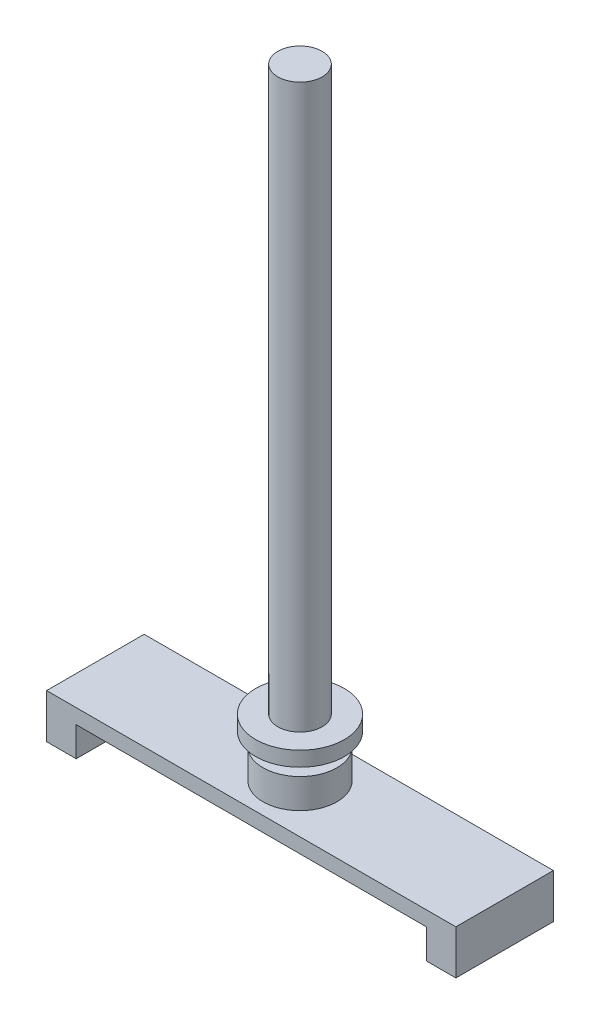
ISO-10303-21;
HEADER;
FILE_DESCRIPTION(('STEP AP214'),'2;1');
FILE_NAME('part.step','',(''),(''),'','','');
FILE_SCHEMA(('AUTOMOTIVE_DESIGN { 1 0 10303 214 1 1 1 1 }'));
ENDSEC;
DATA;
#1=APPLICATION_CONTEXT('core data for automotive mechanical design processes');
#2=APPLICATION_PROTOCOL_DEFINITION('international standard','automotive_design',2000,#1);
#3=PRODUCT_CONTEXT('',#1,'mechanical');
#4=PRODUCT('Part','Part','',(#3));
#5=PRODUCT_RELATED_PRODUCT_CATEGORY('part','',(#4));
#6=PRODUCT_DEFINITION_FORMATION('','',#4);
#7=PRODUCT_DEFINITION_CONTEXT('part definition',#1,'design');
#8=PRODUCT_DEFINITION('design','',#6,#7);
#9=PRODUCT_DEFINITION_SHAPE('','',#8);
#10=(LENGTH_UNIT() NAMED_UNIT(*) SI_UNIT(.MILLI.,.METRE.));
#11=(NAMED_UNIT(*) PLANE_ANGLE_UNIT() SI_UNIT($,.RADIAN.));
#12=(NAMED_UNIT(*) SI_UNIT($,.STERADIAN.) SOLID_ANGLE_UNIT());
#13=UNCERTAINTY_MEASURE_WITH_UNIT(LENGTH_MEASURE(1.E-05),#10,'distance_accuracy_value','');
#14=(GEOMETRIC_REPRESENTATION_CONTEXT(3) GLOBAL_UNCERTAINTY_ASSIGNED_CONTEXT((#13)) GLOBAL_UNIT_ASSIGNED_CONTEXT((#10,
#11,#12)) REPRESENTATION_CONTEXT('',''));
#15=CARTESIAN_POINT('',(0.,0.,0.));
#16=DIRECTION('',(0.,0.,1.));
#17=DIRECTION('',(1.,0.,0.));
#18=AXIS2_PLACEMENT_3D('',#15,#16,#17);
#19=CARTESIAN_POINT('',(0.,420.,0.));
#20=DIRECTION('',(0.,-1.,0.));
#21=DIRECTION('',(1.,0.,0.));
#22=AXIS2_PLACEMENT_3D('',#19,#20,#21);
#23=CYLINDRICAL_SURFACE('',#22,15.);
#24=CARTESIAN_POINT('',(0.,20.,0.));
#25=DIRECTION('',(0.,1.,0.));
#26=DIRECTION('',(-1.,0.,0.));
#27=AXIS2_PLACEMENT_3D('',#24,#25,#26);
#28=CIRCLE('',#27,15.);
#29=CARTESIAN_POINT('',(-15.,20.,0.));
#30=VERTEX_POINT('',#29);
#31=EDGE_CURVE('E42',#30,#30,#28,.T.);
#32=ORIENTED_EDGE('',*,*,#31,.T.);
#33=EDGE_LOOP('',(#32));
#34=FACE_BOUND('',#33,.T.);
#35=CARTESIAN_POINT('',(0.,29.,0.));
#36=DIRECTION('',(0.,1.,0.));
#37=DIRECTION('',(-1.,0.,0.));
#38=AXIS2_PLACEMENT_3D('',#35,#36,#37);
#39=CIRCLE('',#38,15.);
#40=CARTESIAN_POINT('',(-15.,29.,0.));
#41=VERTEX_POINT('',#40);
#42=EDGE_CURVE('E11',#41,#41,#39,.T.);
#43=ORIENTED_EDGE('',*,*,#42,.F.);
#44=EDGE_LOOP('',(#43));
#45=FACE_BOUND('',#44,.T.);
#46=ADVANCED_FACE('F33',(#34,#45),#23,.T.);
#47=CARTESIAN_POINT('',(-138.5,-29.9999999999999,-33.));
#48=DIRECTION('',(0.,-1.,0.));
#49=DIRECTION('',(1.,0.,0.));
#50=AXIS2_PLACEMENT_3D('',#47,#48,#49);
#51=PLANE('',#50);
#52=DIRECTION('',(0.,0.,1.));
#53=VECTOR('',#52,1.);
#54=CARTESIAN_POINT('',(-123.5,-30.,31.5));
#55=LINE('',#54,#53);
#56=CARTESIAN_POINT('',(-123.5,-30.,-31.5));
#57=VERTEX_POINT('',#56);
#58=CARTESIAN_POINT('',(-123.5,-29.9999999999999,31.5));
#59=VERTEX_POINT('',#58);
#60=EDGE_CURVE('E49',#57,#59,#55,.T.);
#61=ORIENTED_EDGE('',*,*,#60,.F.);
#62=DIRECTION('',(1.,0.,0.));
#63=VECTOR('',#62,1.);
#64=CARTESIAN_POINT('',(-133.5,-30.,-31.5));
#65=LINE('',#64,#63);
#66=CARTESIAN_POINT('',(-133.5,-30.,-31.5));
#67=VERTEX_POINT('',#66);
#68=EDGE_CURVE('E167',#67,#57,#65,.T.);
#69=ORIENTED_EDGE('',*,*,#68,.F.);
#70=DIRECTION('',(0.,0.,-1.));
#71=VECTOR('',#70,1.);
#72=CARTESIAN_POINT('',(-133.5,-30.,31.5));
#73=LINE('',#72,#71);
#74=CARTESIAN_POINT('',(-133.5,-30.,31.5));
#75=VERTEX_POINT('',#74);
#76=EDGE_CURVE('E170',#75,#67,#73,.T.);
#77=ORIENTED_EDGE('',*,*,#76,.F.);
#78=DIRECTION('',(-1.,0.,0.));
#79=VECTOR('',#78,1.);
#80=CARTESIAN_POINT('',(-133.5,-30.,31.5));
#81=LINE('',#80,#79);
#82=EDGE_CURVE('E179',#59,#75,#81,.T.);
#83=ORIENTED_EDGE('',*,*,#82,.F.);
#84=EDGE_LOOP('',(#61,#69,#77,#83));
#85=FACE_BOUND('',#84,.T.);
#86=DIRECTION('',(0.,0.,1.));
#87=VECTOR('',#86,1.);
#88=CARTESIAN_POINT('',(-118.5,-29.9999999999999,-33.));
#89=LINE('',#88,#87);
#90=CARTESIAN_POINT('',(-118.5,-29.9999999999999,-33.));
#91=VERTEX_POINT('',#90);
#92=CARTESIAN_POINT('',(-118.5,-29.9999999999999,33.));
#93=VERTEX_POINT('',#92);
#94=EDGE_CURVE('E267',#91,#93,#89,.T.);
#95=ORIENTED_EDGE('',*,*,#94,.T.);
#96=DIRECTION('',(1.,0.,0.));
#97=VECTOR('',#96,1.);
#98=CARTESIAN_POINT('',(-138.5,-29.9999999999999,33.));
#99=LINE('',#98,#97);
#100=CARTESIAN_POINT('',(-138.5,-29.9999999999999,33.));
#101=VERTEX_POINT('',#100);
#102=EDGE_CURVE('E186',#101,#93,#99,.T.);
#103=ORIENTED_EDGE('',*,*,#102,.F.);
#104=DIRECTION('',(0.,0.,1.));
#105=VECTOR('',#104,1.);
#106=CARTESIAN_POINT('',(-138.5,-29.9999999999999,-33.));
#107=LINE('',#106,#105);
#108=CARTESIAN_POINT('',(-138.5,-29.9999999999999,-33.));
#109=VERTEX_POINT('',#108);
#110=EDGE_CURVE('E268',#109,#101,#107,.T.);
#111=ORIENTED_EDGE('',*,*,#110,.F.);
#112=DIRECTION('',(1.,0.,0.));
#113=VECTOR('',#112,1.);
#114=CARTESIAN_POINT('',(-138.5,-29.9999999999999,-33.));
#115=LINE('',#114,#113);
#116=EDGE_CURVE('E243',#109,#91,#115,.T.);
#117=ORIENTED_EDGE('',*,*,#116,.T.);
#118=EDGE_LOOP('',(#95,#103,#111,#117));
#119=FACE_BOUND('',#118,.T.);
#120=ADVANCED_FACE('F35',(#85,#119),#51,.T.);
#121=CARTESIAN_POINT('',(-138.5,0.,-33.));
#122=DIRECTION('',(-1.,0.,0.));
#123=DIRECTION('',(0.,-1.,0.));
#124=AXIS2_PLACEMENT_3D('',#121,#122,#123);
#125=PLANE('',#124);
#126=ORIENTED_EDGE('',*,*,#110,.T.);
#127=DIRECTION('',(0.,-1.,0.));
#128=VECTOR('',#127,1.);
#129=CARTESIAN_POINT('',(-138.5,0.,33.));
#130=LINE('',#129,#128);
#131=CARTESIAN_POINT('',(-138.5,0.,33.));
#132=VERTEX_POINT('',#131);
#133=EDGE_CURVE('E240',#132,#101,#130,.T.);
#134=ORIENTED_EDGE('',*,*,#133,.F.);
#135=DIRECTION('',(0.,0.,1.));
#136=VECTOR('',#135,1.);
#137=CARTESIAN_POINT('',(-138.5,0.,-33.));
#138=LINE('',#137,#136);
#139=CARTESIAN_POINT('',(-138.5,0.,-33.));
#140=VERTEX_POINT('',#139);
#141=EDGE_CURVE('E270',#140,#132,#138,.T.);
#142=ORIENTED_EDGE('',*,*,#141,.F.);
#143=DIRECTION('',(0.,-1.,0.));
#144=VECTOR('',#143,1.);
#145=CARTESIAN_POINT('',(-138.5,0.,-33.));
#146=LINE('',#145,#144);
#147=EDGE_CURVE('E264',#140,#109,#146,.T.);
#148=ORIENTED_EDGE('',*,*,#147,.T.);
#149=EDGE_LOOP('',(#126,#134,#142,#148));
#150=FACE_BOUND('',#149,.T.);
#151=ADVANCED_FACE('F295',(#150),#125,.T.);
#152=CARTESIAN_POINT('',(-138.5,0.,-33.));
#153=DIRECTION('',(0.,1.,0.));
#154=DIRECTION('',(0.,0.,1.));
#155=AXIS2_PLACEMENT_3D('',#152,#153,#154);
#156=PLANE('',#155);
#157=CARTESIAN_POINT('',(0.,0.,0.));
#158=DIRECTION('',(0.,1.,0.));
#159=DIRECTION('',(-1.,0.,0.));
#160=AXIS2_PLACEMENT_3D('',#157,#158,#159);
#161=CIRCLE('',#160,25.);
#162=CARTESIAN_POINT('',(-25.,0.,0.));
#163=VERTEX_POINT('',#162);
#164=EDGE_CURVE('E173',#163,#163,#161,.T.);
#165=ORIENTED_EDGE('',*,*,#164,.F.);
#166=EDGE_LOOP('',(#165));
#167=FACE_BOUND('',#166,.T.);
#168=ORIENTED_EDGE('',*,*,#141,.T.);
#169=DIRECTION('',(-1.,0.,0.));
#170=VECTOR('',#169,1.);
#171=CARTESIAN_POINT('',(-138.5,0.,33.));
#172=LINE('',#171,#170);
#173=CARTESIAN_POINT('',(138.5,0.,33.));
#174=VERTEX_POINT('',#173);
#175=EDGE_CURVE('E237',#174,#132,#172,.T.);
#176=ORIENTED_EDGE('',*,*,#175,.F.);
#177=DIRECTION('',(0.,0.,1.));
#178=VECTOR('',#177,1.);
#179=CARTESIAN_POINT('',(138.5,0.,-33.));
#180=LINE('',#179,#178);
#181=CARTESIAN_POINT('',(138.5,0.,-33.));
#182=VERTEX_POINT('',#181);
#183=EDGE_CURVE('E272',#182,#174,#180,.T.);
#184=ORIENTED_EDGE('',*,*,#183,.F.);
#185=DIRECTION('',(-1.,0.,0.));
#186=VECTOR('',#185,1.);
#187=CARTESIAN_POINT('',(-138.5,0.,-33.));
#188=LINE('',#187,#186);
#189=EDGE_CURVE('E261',#182,#140,#188,.T.);
#190=ORIENTED_EDGE('',*,*,#189,.T.);
#191=EDGE_LOOP('',(#168,#176,#184,#190));
#192=FACE_BOUND('',#191,.T.);
#193=ADVANCED_FACE('F316',(#167,#192),#156,.T.);
#194=CARTESIAN_POINT('',(138.5,0.,-33.));
#195=DIRECTION('',(1.,0.,0.));
#196=DIRECTION('',(0.,1.,0.));
#197=AXIS2_PLACEMENT_3D('',#194,#195,#196);
#198=PLANE('',#197);
#199=ORIENTED_EDGE('',*,*,#183,.T.);
#200=DIRECTION('',(0.,1.,0.));
#201=VECTOR('',#200,1.);
#202=CARTESIAN_POINT('',(138.5,0.,33.));
#203=LINE('',#202,#201);
#204=CARTESIAN_POINT('',(138.5,-29.9999999999999,33.));
#205=VERTEX_POINT('',#204);
#206=EDGE_CURVE('E234',#205,#174,#203,.T.);
#207=ORIENTED_EDGE('',*,*,#206,.F.);
#208=DIRECTION('',(0.,0.,1.));
#209=VECTOR('',#208,1.);
#210=CARTESIAN_POINT('',(138.5,-29.9999999999999,-33.));
#211=LINE('',#210,#209);
#212=CARTESIAN_POINT('',(138.5,-29.9999999999999,-33.));
#213=VERTEX_POINT('',#212);
#214=EDGE_CURVE('E274',#213,#205,#211,.T.);
#215=ORIENTED_EDGE('',*,*,#214,.F.);
#216=DIRECTION('',(0.,1.,0.));
#217=VECTOR('',#216,1.);
#218=CARTESIAN_POINT('',(138.5,0.,-33.));
#219=LINE('',#218,#217);
#220=EDGE_CURVE('E258',#213,#182,#219,.T.);
#221=ORIENTED_EDGE('',*,*,#220,.T.);
#222=EDGE_LOOP('',(#199,#207,#215,#221));
#223=FACE_BOUND('',#222,.T.);
#224=ADVANCED_FACE('F313',(#223),#198,.T.);
#225=CARTESIAN_POINT('',(138.5,-29.9999999999999,-33.));
#226=DIRECTION('',(0.,-1.,0.));
#227=DIRECTION('',(1.,0.,0.));
#228=AXIS2_PLACEMENT_3D('',#225,#226,#227);
#229=PLANE('',#228);
#230=DIRECTION('',(0.,0.,1.));
#231=VECTOR('',#230,1.);
#232=CARTESIAN_POINT('',(133.5,-30.,31.5));
#233=LINE('',#232,#231);
#234=CARTESIAN_POINT('',(133.5,-30.,-31.5));
#235=VERTEX_POINT('',#234);
#236=CARTESIAN_POINT('',(133.5,-29.9999999999999,31.5));
#237=VERTEX_POINT('',#236);
#238=EDGE_CURVE('E57',#235,#237,#233,.T.);
#239=ORIENTED_EDGE('',*,*,#238,.F.);
#240=DIRECTION('',(1.,0.,0.));
#241=VECTOR('',#240,1.);
#242=CARTESIAN_POINT('',(133.5,-30.,-31.5));
#243=LINE('',#242,#241);
#244=CARTESIAN_POINT('',(123.5,-30.,-31.5));
#245=VERTEX_POINT('',#244);
#246=EDGE_CURVE('E194',#245,#235,#243,.T.);
#247=ORIENTED_EDGE('',*,*,#246,.F.);
#248=DIRECTION('',(0.,0.,-1.));
#249=VECTOR('',#248,1.);
#250=CARTESIAN_POINT('',(123.5,-30.,31.5));
#251=LINE('',#250,#249);
#252=CARTESIAN_POINT('',(123.5,-30.,31.5));
#253=VERTEX_POINT('',#252);
#254=EDGE_CURVE('E209',#253,#245,#251,.T.);
#255=ORIENTED_EDGE('',*,*,#254,.F.);
#256=DIRECTION('',(-1.,0.,0.));
#257=VECTOR('',#256,1.);
#258=CARTESIAN_POINT('',(133.5,-30.,31.5));
#259=LINE('',#258,#257);
#260=EDGE_CURVE('E205',#237,#253,#259,.T.);
#261=ORIENTED_EDGE('',*,*,#260,.F.);
#262=EDGE_LOOP('',(#239,#247,#255,#261));
#263=FACE_BOUND('',#262,.T.);
#264=ORIENTED_EDGE('',*,*,#214,.T.);
#265=DIRECTION('',(1.,0.,0.));
#266=VECTOR('',#265,1.);
#267=CARTESIAN_POINT('',(138.5,-29.9999999999999,33.));
#268=LINE('',#267,#266);
#269=CARTESIAN_POINT('',(118.5,-29.9999999999999,33.));
#270=VERTEX_POINT('',#269);
#271=EDGE_CURVE('E231',#270,#205,#268,.T.);
#272=ORIENTED_EDGE('',*,*,#271,.F.);
#273=DIRECTION('',(0.,0.,1.));
#274=VECTOR('',#273,1.);
#275=CARTESIAN_POINT('',(118.5,-29.9999999999999,-33.));
#276=LINE('',#275,#274);
#277=CARTESIAN_POINT('',(118.5,-29.9999999999999,-33.));
#278=VERTEX_POINT('',#277);
#279=EDGE_CURVE('E276',#278,#270,#276,.T.);
#280=ORIENTED_EDGE('',*,*,#279,.F.);
#281=DIRECTION('',(1.,0.,0.));
#282=VECTOR('',#281,1.);
#283=CARTESIAN_POINT('',(138.5,-29.9999999999999,-33.));
#284=LINE('',#283,#282);
#285=EDGE_CURVE('E255',#278,#213,#284,.T.);
#286=ORIENTED_EDGE('',*,*,#285,.T.);
#287=EDGE_LOOP('',(#264,#272,#280,#286));
#288=FACE_BOUND('',#287,.T.);
#289=ADVANCED_FACE('F310',(#263,#288),#229,.T.);
#290=CARTESIAN_POINT('',(118.5,-29.9999999999999,-33.));
#291=DIRECTION('',(-1.,0.,0.));
#292=DIRECTION('',(0.,0.,1.));
#293=AXIS2_PLACEMENT_3D('',#290,#291,#292);
#294=PLANE('',#293);
#295=ORIENTED_EDGE('',*,*,#279,.T.);
#296=DIRECTION('',(0.,-1.,0.));
#297=VECTOR('',#296,1.);
#298=CARTESIAN_POINT('',(118.5,-29.9999999999999,33.));
#299=LINE('',#298,#297);
#300=CARTESIAN_POINT('',(118.5,-9.99999999999993,33.));
#301=VERTEX_POINT('',#300);
#302=EDGE_CURVE('E228',#301,#270,#299,.T.);
#303=ORIENTED_EDGE('',*,*,#302,.F.);
#304=DIRECTION('',(0.,0.,1.));
#305=VECTOR('',#304,1.);
#306=CARTESIAN_POINT('',(118.5,-9.99999999999993,-33.));
#307=LINE('',#306,#305);
#308=CARTESIAN_POINT('',(118.5,-9.99999999999993,-33.));
#309=VERTEX_POINT('',#308);
#310=EDGE_CURVE('E278',#309,#301,#307,.T.);
#311=ORIENTED_EDGE('',*,*,#310,.F.);
#312=DIRECTION('',(0.,-1.,0.));
#313=VECTOR('',#312,1.);
#314=CARTESIAN_POINT('',(118.5,-29.9999999999999,-33.));
#315=LINE('',#314,#313);
#316=EDGE_CURVE('E252',#309,#278,#315,.T.);
#317=ORIENTED_EDGE('',*,*,#316,.T.);
#318=EDGE_LOOP('',(#295,#303,#311,#317));
#319=FACE_BOUND('',#318,.T.);
#320=ADVANCED_FACE('F308',(#319),#294,.T.);
#321=CARTESIAN_POINT('',(118.5,-9.99999999999993,-33.));
#322=DIRECTION('',(0.,-1.,0.));
#323=DIRECTION('',(0.,0.,-1.));
#324=AXIS2_PLACEMENT_3D('',#321,#322,#323);
#325=PLANE('',#324);
#326=ORIENTED_EDGE('',*,*,#310,.T.);
#327=DIRECTION('',(1.,0.,0.));
#328=VECTOR('',#327,1.);
#329=CARTESIAN_POINT('',(118.5,-9.99999999999993,33.));
#330=LINE('',#329,#328);
#331=CARTESIAN_POINT('',(-118.5,-9.99999999999993,33.));
#332=VERTEX_POINT('',#331);
#333=EDGE_CURVE('E225',#332,#301,#330,.T.);
#334=ORIENTED_EDGE('',*,*,#333,.F.);
#335=DIRECTION('',(0.,0.,1.));
#336=VECTOR('',#335,1.);
#337=CARTESIAN_POINT('',(-118.5,-9.99999999999993,-33.));
#338=LINE('',#337,#336);
#339=CARTESIAN_POINT('',(-118.5,-9.99999999999993,-33.));
#340=VERTEX_POINT('',#339);
#341=EDGE_CURVE('E280',#340,#332,#338,.T.);
#342=ORIENTED_EDGE('',*,*,#341,.F.);
#343=DIRECTION('',(1.,0.,0.));
#344=VECTOR('',#343,1.);
#345=CARTESIAN_POINT('',(118.5,-9.99999999999993,-33.));
#346=LINE('',#345,#344);
#347=EDGE_CURVE('E249',#340,#309,#346,.T.);
#348=ORIENTED_EDGE('',*,*,#347,.T.);
#349=EDGE_LOOP('',(#326,#334,#342,#348));
#350=FACE_BOUND('',#349,.T.);
#351=ADVANCED_FACE('F304',(#350),#325,.T.);
#352=CARTESIAN_POINT('',(-118.5,-29.9999999999999,-33.));
#353=DIRECTION('',(1.,0.,0.));
#354=DIRECTION('',(0.,0.,-1.));
#355=AXIS2_PLACEMENT_3D('',#352,#353,#354);
#356=PLANE('',#355);
#357=ORIENTED_EDGE('',*,*,#341,.T.);
#358=DIRECTION('',(0.,1.,0.));
#359=VECTOR('',#358,1.);
#360=CARTESIAN_POINT('',(-118.5,-29.9999999999999,33.));
#361=LINE('',#360,#359);
#362=EDGE_CURVE('E222',#93,#332,#361,.T.);
#363=ORIENTED_EDGE('',*,*,#362,.F.);
#364=ORIENTED_EDGE('',*,*,#94,.F.);
#365=DIRECTION('',(0.,1.,0.));
#366=VECTOR('',#365,1.);
#367=CARTESIAN_POINT('',(-118.5,-29.9999999999999,-33.));
#368=LINE('',#367,#366);
#369=EDGE_CURVE('E246',#91,#340,#368,.T.);
#370=ORIENTED_EDGE('',*,*,#369,.T.);
#371=EDGE_LOOP('',(#357,#363,#364,#370));
#372=FACE_BOUND('',#371,.T.);
#373=ADVANCED_FACE('F288',(#372),#356,.T.);
#374=CARTESIAN_POINT('',(0.,0.,-33.));
#375=DIRECTION('',(0.,0.,1.));
#376=DIRECTION('',(1.,0.,0.));
#377=AXIS2_PLACEMENT_3D('',#374,#375,#376);
#378=PLANE('',#377);
#379=ORIENTED_EDGE('',*,*,#116,.F.);
#380=ORIENTED_EDGE('',*,*,#147,.F.);
#381=ORIENTED_EDGE('',*,*,#189,.F.);
#382=ORIENTED_EDGE('',*,*,#220,.F.);
#383=ORIENTED_EDGE('',*,*,#285,.F.);
#384=ORIENTED_EDGE('',*,*,#316,.F.);
#385=ORIENTED_EDGE('',*,*,#347,.F.);
#386=ORIENTED_EDGE('',*,*,#369,.F.);
#387=EDGE_LOOP('',(#379,#380,#381,#382,#383,#384,#385,#386));
#388=FACE_BOUND('',#387,.T.);
#389=ADVANCED_FACE('F298',(#388),#378,.F.);
#390=CARTESIAN_POINT('',(0.,0.,33.));
#391=DIRECTION('',(0.,0.,1.));
#392=DIRECTION('',(1.,0.,0.));
#393=AXIS2_PLACEMENT_3D('',#390,#391,#392);
#394=PLANE('',#393);
#395=ORIENTED_EDGE('',*,*,#102,.T.);
#396=ORIENTED_EDGE('',*,*,#362,.T.);
#397=ORIENTED_EDGE('',*,*,#333,.T.);
#398=ORIENTED_EDGE('',*,*,#302,.T.);
#399=ORIENTED_EDGE('',*,*,#271,.T.);
#400=ORIENTED_EDGE('',*,*,#206,.T.);
#401=ORIENTED_EDGE('',*,*,#175,.T.);
#402=ORIENTED_EDGE('',*,*,#133,.T.);
#403=EDGE_LOOP('',(#395,#396,#397,#398,#399,#400,#401,#402));
#404=FACE_BOUND('',#403,.T.);
#405=ADVANCED_FACE('F291',(#404),#394,.T.);
#406=CARTESIAN_POINT('',(133.5,-9.99999999999997,31.5));
#407=DIRECTION('',(1.,0.,0.));
#408=DIRECTION('',(0.,0.,-1.));
#409=AXIS2_PLACEMENT_3D('',#406,#407,#408);
#410=PLANE('',#409);
#411=ORIENTED_EDGE('',*,*,#238,.T.);
#412=DIRECTION('',(0.,-1.,0.));
#413=VECTOR('',#412,1.);
#414=CARTESIAN_POINT('',(133.5,-9.99999999999997,31.5));
#415=LINE('',#414,#413);
#416=CARTESIAN_POINT('',(133.5,-9.99999999999997,31.5));
#417=VERTEX_POINT('',#416);
#418=EDGE_CURVE('E203',#417,#237,#415,.T.);
#419=ORIENTED_EDGE('',*,*,#418,.F.);
#420=DIRECTION('',(0.,0.,1.));
#421=VECTOR('',#420,1.);
#422=CARTESIAN_POINT('',(133.5,-9.99999999999997,31.5));
#423=LINE('',#422,#421);
#424=CARTESIAN_POINT('',(133.5,-9.99999999999997,-31.5));
#425=VERTEX_POINT('',#424);
#426=EDGE_CURVE('E190',#425,#417,#423,.T.);
#427=ORIENTED_EDGE('',*,*,#426,.F.);
#428=DIRECTION('',(0.,-1.,0.));
#429=VECTOR('',#428,1.);
#430=CARTESIAN_POINT('',(133.5,-9.99999999999997,-31.5));
#431=LINE('',#430,#429);
#432=EDGE_CURVE('E180',#425,#235,#431,.T.);
#433=ORIENTED_EDGE('',*,*,#432,.T.);
#434=EDGE_LOOP('',(#411,#419,#427,#433));
#435=FACE_BOUND('',#434,.T.);
#436=ADVANCED_FACE('F398',(#435),#410,.F.);
#437=CARTESIAN_POINT('',(133.5,-9.99999999999997,-31.5));
#438=DIRECTION('',(0.,0.,-1.));
#439=DIRECTION('',(-1.,0.,0.));
#440=AXIS2_PLACEMENT_3D('',#437,#438,#439);
#441=PLANE('',#440);
#442=ORIENTED_EDGE('',*,*,#246,.T.);
#443=ORIENTED_EDGE('',*,*,#432,.F.);
#444=DIRECTION('',(1.,0.,0.));
#445=VECTOR('',#444,1.);
#446=CARTESIAN_POINT('',(133.5,-9.99999999999997,-31.5));
#447=LINE('',#446,#445);
#448=CARTESIAN_POINT('',(123.5,-9.99999999999997,-31.5));
#449=VERTEX_POINT('',#448);
#450=EDGE_CURVE('E200',#449,#425,#447,.T.);
#451=ORIENTED_EDGE('',*,*,#450,.F.);
#452=DIRECTION('',(0.,-1.,0.));
#453=VECTOR('',#452,1.);
#454=CARTESIAN_POINT('',(123.5,-9.99999999999997,-31.5));
#455=LINE('',#454,#453);
#456=EDGE_CURVE('E215',#449,#245,#455,.T.);
#457=ORIENTED_EDGE('',*,*,#456,.T.);
#458=EDGE_LOOP('',(#442,#443,#451,#457));
#459=FACE_BOUND('',#458,.T.);
#460=ADVANCED_FACE('F394',(#459),#441,.F.);
#461=CARTESIAN_POINT('',(123.5,-9.99999999999997,31.5));
#462=DIRECTION('',(-1.,0.,0.));
#463=DIRECTION('',(0.,0.,1.));
#464=AXIS2_PLACEMENT_3D('',#461,#462,#463);
#465=PLANE('',#464);
#466=ORIENTED_EDGE('',*,*,#254,.T.);
#467=ORIENTED_EDGE('',*,*,#456,.F.);
#468=DIRECTION('',(0.,0.,-1.));
#469=VECTOR('',#468,1.);
#470=CARTESIAN_POINT('',(123.5,-9.99999999999997,31.5));
#471=LINE('',#470,#469);
#472=CARTESIAN_POINT('',(123.5,-9.99999999999997,31.5));
#473=VERTEX_POINT('',#472);
#474=EDGE_CURVE('E197',#473,#449,#471,.T.);
#475=ORIENTED_EDGE('',*,*,#474,.F.);
#476=DIRECTION('',(0.,-1.,0.));
#477=VECTOR('',#476,1.);
#478=CARTESIAN_POINT('',(123.5,-9.99999999999997,31.5));
#479=LINE('',#478,#477);
#480=EDGE_CURVE('E217',#473,#253,#479,.T.);
#481=ORIENTED_EDGE('',*,*,#480,.T.);
#482=EDGE_LOOP('',(#466,#467,#475,#481));
#483=FACE_BOUND('',#482,.T.);
#484=ADVANCED_FACE('F397',(#483),#465,.F.);
#485=CARTESIAN_POINT('',(133.5,-9.99999999999997,31.5));
#486=DIRECTION('',(0.,0.,1.));
#487=DIRECTION('',(1.,0.,0.));
#488=AXIS2_PLACEMENT_3D('',#485,#486,#487);
#489=PLANE('',#488);
#490=ORIENTED_EDGE('',*,*,#260,.T.);
#491=ORIENTED_EDGE('',*,*,#480,.F.);
#492=DIRECTION('',(-1.,0.,0.));
#493=VECTOR('',#492,1.);
#494=CARTESIAN_POINT('',(133.5,-9.99999999999997,31.5));
#495=LINE('',#494,#493);
#496=EDGE_CURVE('E193',#417,#473,#495,.T.);
#497=ORIENTED_EDGE('',*,*,#496,.F.);
#498=ORIENTED_EDGE('',*,*,#418,.T.);
#499=EDGE_LOOP('',(#490,#491,#497,#498));
#500=FACE_BOUND('',#499,.T.);
#501=ADVANCED_FACE('F392',(#500),#489,.F.);
#502=CARTESIAN_POINT('',(0.,-9.99999999999997,0.));
#503=DIRECTION('',(0.,1.,0.));
#504=DIRECTION('',(0.,0.,1.));
#505=AXIS2_PLACEMENT_3D('',#502,#503,#504);
#506=PLANE('',#505);
#507=ORIENTED_EDGE('',*,*,#426,.T.);
#508=ORIENTED_EDGE('',*,*,#496,.T.);
#509=ORIENTED_EDGE('',*,*,#474,.T.);
#510=ORIENTED_EDGE('',*,*,#450,.T.);
#511=EDGE_LOOP('',(#507,#508,#509,#510));
#512=FACE_BOUND('',#511,.T.);
#513=ADVANCED_FACE('F389',(#512),#506,.F.);
#514=CARTESIAN_POINT('',(-123.5,-9.99999999999997,31.5));
#515=DIRECTION('',(1.,0.,0.));
#516=DIRECTION('',(0.,0.,-1.));
#517=AXIS2_PLACEMENT_3D('',#514,#515,#516);
#518=PLANE('',#517);
#519=ORIENTED_EDGE('',*,*,#60,.T.);
#520=DIRECTION('',(0.,-1.,0.));
#521=VECTOR('',#520,1.);
#522=CARTESIAN_POINT('',(-123.5,-9.99999999999997,31.5));
#523=LINE('',#522,#521);
#524=CARTESIAN_POINT('',(-123.5,-9.99999999999997,31.5));
#525=VERTEX_POINT('',#524);
#526=EDGE_CURVE('E145',#525,#59,#523,.T.);
#527=ORIENTED_EDGE('',*,*,#526,.F.);
#528=DIRECTION('',(0.,0.,1.));
#529=VECTOR('',#528,1.);
#530=CARTESIAN_POINT('',(-123.5,-9.99999999999997,31.5));
#531=LINE('',#530,#529);
#532=CARTESIAN_POINT('',(-123.5,-9.99999999999997,-31.5));
#533=VERTEX_POINT('',#532);
#534=EDGE_CURVE('E149',#533,#525,#531,.T.);
#535=ORIENTED_EDGE('',*,*,#534,.F.);
#536=DIRECTION('',(0.,-1.,0.));
#537=VECTOR('',#536,1.);
#538=CARTESIAN_POINT('',(-123.5,-9.99999999999997,-31.5));
#539=LINE('',#538,#537);
#540=EDGE_CURVE('E184',#533,#57,#539,.T.);
#541=ORIENTED_EDGE('',*,*,#540,.T.);
#542=EDGE_LOOP('',(#519,#527,#535,#541));
#543=FACE_BOUND('',#542,.T.);
#544=ADVANCED_FACE('F147',(#543),#518,.F.);
#545=CARTESIAN_POINT('',(-133.5,-9.99999999999997,-31.5));
#546=DIRECTION('',(0.,0.,-1.));
#547=DIRECTION('',(-1.,0.,0.));
#548=AXIS2_PLACEMENT_3D('',#545,#546,#547);
#549=PLANE('',#548);
#550=ORIENTED_EDGE('',*,*,#68,.T.);
#551=ORIENTED_EDGE('',*,*,#540,.F.);
#552=DIRECTION('',(1.,0.,0.));
#553=VECTOR('',#552,1.);
#554=CARTESIAN_POINT('',(-133.5,-9.99999999999997,-31.5));
#555=LINE('',#554,#553);
#556=CARTESIAN_POINT('',(-133.5,-9.99999999999997,-31.5));
#557=VERTEX_POINT('',#556);
#558=EDGE_CURVE('E155',#557,#533,#555,.T.);
#559=ORIENTED_EDGE('',*,*,#558,.F.);
#560=DIRECTION('',(0.,-1.,0.));
#561=VECTOR('',#560,1.);
#562=CARTESIAN_POINT('',(-133.5,-9.99999999999997,-31.5));
#563=LINE('',#562,#561);
#564=EDGE_CURVE('E187',#557,#67,#563,.T.);
#565=ORIENTED_EDGE('',*,*,#564,.T.);
#566=EDGE_LOOP('',(#550,#551,#559,#565));
#567=FACE_BOUND('',#566,.T.);
#568=ADVANCED_FACE('F377',(#567),#549,.F.);
#569=CARTESIAN_POINT('',(-133.5,-9.99999999999997,31.5));
#570=DIRECTION('',(-1.,0.,0.));
#571=DIRECTION('',(0.,0.,1.));
#572=AXIS2_PLACEMENT_3D('',#569,#570,#571);
#573=PLANE('',#572);
#574=ORIENTED_EDGE('',*,*,#76,.T.);
#575=ORIENTED_EDGE('',*,*,#564,.F.);
#576=DIRECTION('',(0.,0.,-1.));
#577=VECTOR('',#576,1.);
#578=CARTESIAN_POINT('',(-133.5,-9.99999999999997,31.5));
#579=LINE('',#578,#577);
#580=CARTESIAN_POINT('',(-133.5,-9.99999999999997,31.5));
#581=VERTEX_POINT('',#580);
#582=EDGE_CURVE('E163',#581,#557,#579,.T.);
#583=ORIENTED_EDGE('',*,*,#582,.F.);
#584=DIRECTION('',(0.,-1.,0.));
#585=VECTOR('',#584,1.);
#586=CARTESIAN_POINT('',(-133.5,-9.99999999999997,31.5));
#587=LINE('',#586,#585);
#588=EDGE_CURVE('E154',#581,#75,#587,.T.);
#589=ORIENTED_EDGE('',*,*,#588,.T.);
#590=EDGE_LOOP('',(#574,#575,#583,#589));
#591=FACE_BOUND('',#590,.T.);
#592=ADVANCED_FACE('F380',(#591),#573,.F.);
#593=CARTESIAN_POINT('',(-133.5,-9.99999999999997,31.5));
#594=DIRECTION('',(0.,0.,1.));
#595=DIRECTION('',(1.,0.,0.));
#596=AXIS2_PLACEMENT_3D('',#593,#594,#595);
#597=PLANE('',#596);
#598=ORIENTED_EDGE('',*,*,#82,.T.);
#599=ORIENTED_EDGE('',*,*,#588,.F.);
#600=DIRECTION('',(-1.,0.,0.));
#601=VECTOR('',#600,1.);
#602=CARTESIAN_POINT('',(-133.5,-9.99999999999997,31.5));
#603=LINE('',#602,#601);
#604=EDGE_CURVE('E158',#525,#581,#603,.T.);
#605=ORIENTED_EDGE('',*,*,#604,.F.);
#606=ORIENTED_EDGE('',*,*,#526,.T.);
#607=EDGE_LOOP('',(#598,#599,#605,#606));
#608=FACE_BOUND('',#607,.T.);
#609=ADVANCED_FACE('F159',(#608),#597,.F.);
#610=CARTESIAN_POINT('',(0.,-9.99999999999997,0.));
#611=DIRECTION('',(0.,-1.,0.));
#612=DIRECTION('',(0.,0.,-1.));
#613=AXIS2_PLACEMENT_3D('',#610,#611,#612);
#614=PLANE('',#613);
#615=ORIENTED_EDGE('',*,*,#534,.T.);
#616=ORIENTED_EDGE('',*,*,#604,.T.);
#617=ORIENTED_EDGE('',*,*,#582,.T.);
#618=ORIENTED_EDGE('',*,*,#558,.T.);
#619=EDGE_LOOP('',(#615,#616,#617,#618));
#620=FACE_BOUND('',#619,.T.);
#621=ADVANCED_FACE('F165',(#620),#614,.T.);
#622=CARTESIAN_POINT('',(0.,20.,0.));
#623=DIRECTION('',(0.,-1.,0.));
#624=DIRECTION('',(1.,0.,0.));
#625=AXIS2_PLACEMENT_3D('',#622,#623,#624);
#626=CYLINDRICAL_SURFACE('',#625,25.);
#627=CARTESIAN_POINT('',(0.,20.,0.));
#628=DIRECTION('',(0.,1.,0.));
#629=DIRECTION('',(-1.,0.,0.));
#630=AXIS2_PLACEMENT_3D('',#627,#628,#629);
#631=CIRCLE('',#630,25.);
#632=CARTESIAN_POINT('',(-25.,20.,0.));
#633=VERTEX_POINT('',#632);
#634=EDGE_CURVE('E206',#633,#633,#631,.T.);
#635=ORIENTED_EDGE('',*,*,#634,.F.);
#636=EDGE_LOOP('',(#635));
#637=FACE_BOUND('',#636,.T.);
#638=ORIENTED_EDGE('',*,*,#164,.T.);
#639=EDGE_LOOP('',(#638));
#640=FACE_BOUND('',#639,.T.);
#641=ADVANCED_FACE('F363',(#637,#640),#626,.T.);
#642=CARTESIAN_POINT('',(0.,20.,0.));
#643=DIRECTION('',(0.,1.,0.));
#644=DIRECTION('',(-1.,0.,0.));
#645=AXIS2_PLACEMENT_3D('',#642,#643,#644);
#646=PLANE('',#645);
#647=ORIENTED_EDGE('',*,*,#31,.F.);
#648=EDGE_LOOP('',(#647));
#649=FACE_BOUND('',#648,.T.);
#650=ORIENTED_EDGE('',*,*,#634,.T.);
#651=EDGE_LOOP('',(#650));
#652=FACE_BOUND('',#651,.T.);
#653=ADVANCED_FACE('F365',(#649,#652),#646,.T.);
#654=CARTESIAN_POINT('',(0.,39.,0.));
#655=DIRECTION('',(0.,-1.,0.));
#656=DIRECTION('',(1.,0.,0.));
#657=AXIS2_PLACEMENT_3D('',#654,#655,#656);
#658=CYLINDRICAL_SURFACE('',#657,30.);
#659=CARTESIAN_POINT('',(0.,39.,0.));
#660=DIRECTION('',(0.,1.,0.));
#661=DIRECTION('',(-1.,0.,0.));
#662=AXIS2_PLACEMENT_3D('',#659,#660,#661);
#663=CIRCLE('',#662,30.);
#664=CARTESIAN_POINT('',(-30.,39.,0.));
#665=VERTEX_POINT('',#664);
#666=EDGE_CURVE('E355',#665,#665,#663,.T.);
#667=ORIENTED_EDGE('',*,*,#666,.F.);
#668=EDGE_LOOP('',(#667));
#669=FACE_BOUND('',#668,.T.);
#670=CARTESIAN_POINT('',(0.,29.,0.));
#671=DIRECTION('',(0.,1.,0.));
#672=DIRECTION('',(-1.,0.,0.));
#673=AXIS2_PLACEMENT_3D('',#670,#671,#672);
#674=CIRCLE('',#673,30.);
#675=CARTESIAN_POINT('',(-30.,29.,0.));
#676=VERTEX_POINT('',#675);
#677=EDGE_CURVE('E358',#676,#676,#674,.T.);
#678=ORIENTED_EDGE('',*,*,#677,.T.);
#679=EDGE_LOOP('',(#678));
#680=FACE_BOUND('',#679,.T.);
#681=ADVANCED_FACE('F372',(#669,#680),#658,.T.);
#682=CARTESIAN_POINT('',(0.,39.,0.));
#683=DIRECTION('',(0.,1.,0.));
#684=DIRECTION('',(-1.,0.,0.));
#685=AXIS2_PLACEMENT_3D('',#682,#683,#684);
#686=PLANE('',#685);
#687=CARTESIAN_POINT('',(0.,39.,0.));
#688=DIRECTION('',(0.,1.,0.));
#689=DIRECTION('',(-1.,0.,0.));
#690=AXIS2_PLACEMENT_3D('',#687,#688,#689);
#691=CIRCLE('',#690,15.);
#692=CARTESIAN_POINT('',(-15.,39.,0.));
#693=VERTEX_POINT('',#692);
#694=EDGE_CURVE('E37',#693,#693,#691,.T.);
#695=ORIENTED_EDGE('',*,*,#694,.F.);
#696=EDGE_LOOP('',(#695));
#697=FACE_BOUND('',#696,.T.);
#698=ORIENTED_EDGE('',*,*,#666,.T.);
#699=EDGE_LOOP('',(#698));
#700=FACE_BOUND('',#699,.T.);
#701=ADVANCED_FACE('F517',(#697,#700),#686,.T.);
#702=CARTESIAN_POINT('',(0.,29.,0.));
#703=DIRECTION('',(0.,1.,0.));
#704=DIRECTION('',(-1.,0.,0.));
#705=AXIS2_PLACEMENT_3D('',#702,#703,#704);
#706=PLANE('',#705);
#707=ORIENTED_EDGE('',*,*,#42,.T.);
#708=EDGE_LOOP('',(#707));
#709=FACE_BOUND('',#708,.T.);
#710=ORIENTED_EDGE('',*,*,#677,.F.);
#711=EDGE_LOOP('',(#710));
#712=FACE_BOUND('',#711,.T.);
#713=ADVANCED_FACE('F345',(#709,#712),#706,.F.);
#714=CARTESIAN_POINT('',(0.,420.,0.));
#715=DIRECTION('',(0.,1.,0.));
#716=DIRECTION('',(-1.,0.,0.));
#717=AXIS2_PLACEMENT_3D('',#714,#715,#716);
#718=PLANE('',#717);
#719=CARTESIAN_POINT('',(0.,420.,0.));
#720=DIRECTION('',(0.,1.,0.));
#721=DIRECTION('',(-1.,0.,0.));
#722=AXIS2_PLACEMENT_3D('',#719,#720,#721);
#723=CIRCLE('',#722,15.);
#724=CARTESIAN_POINT('',(-15.0000000000001,420.,0.));
#725=VERTEX_POINT('',#724);
#726=EDGE_CURVE('E352',#725,#725,#723,.T.);
#727=ORIENTED_EDGE('',*,*,#726,.T.);
#728=EDGE_LOOP('',(#727));
#729=FACE_BOUND('',#728,.T.);
#730=ADVANCED_FACE('F340',(#729),#718,.T.);
#731=ORIENTED_EDGE('',*,*,#694,.T.);
#732=EDGE_LOOP('',(#731));
#733=FACE_BOUND('',#732,.T.);
#734=ORIENTED_EDGE('',*,*,#726,.F.);
#735=EDGE_LOOP('',(#734));
#736=FACE_BOUND('',#735,.T.);
#737=ADVANCED_FACE('F330',(#733,#736),#23,.T.);
#738=CLOSED_SHELL('',(#46,#120,#151,#193,#224,#289,#320,#351,#373,#389,#405,#436,#460,#484,#501,
#513,#544,#568,#592,#609,#621,#641,#653,#681,#701,#713,#730,#737));
#739=MANIFOLD_SOLID_BREP('B2',#738);
#740=ADVANCED_BREP_SHAPE_REPRESENTATION('',(#18,#739),#14);
#741=SHAPE_DEFINITION_REPRESENTATION(#9,#740);
ENDSEC;
END-ISO-10303-21;
